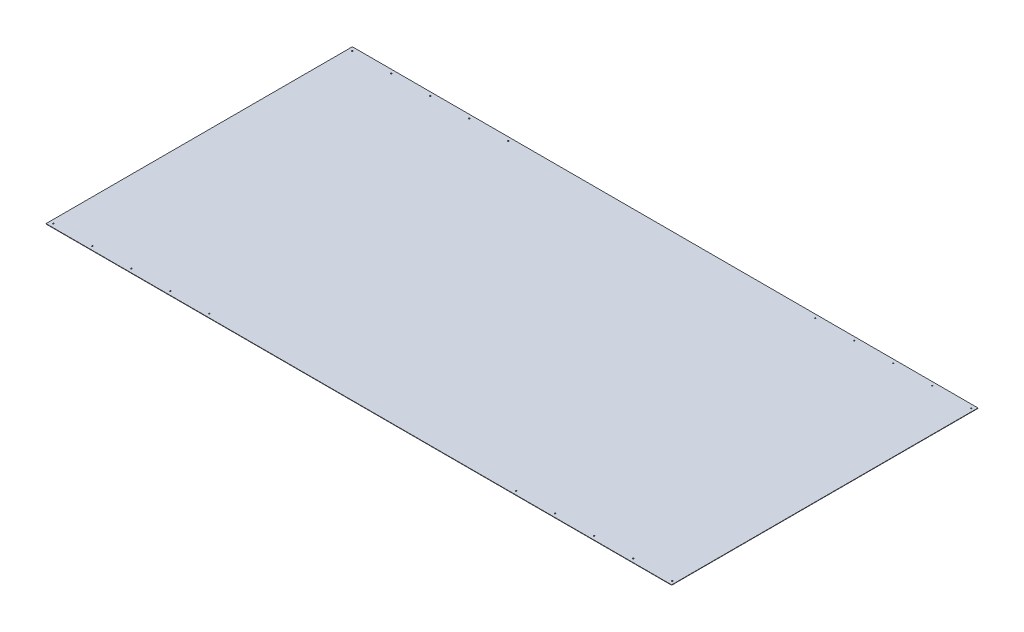
ISO-10303-21;
HEADER;
FILE_DESCRIPTION(('STEP AP214'),'2;1');
FILE_NAME('part.step','',(''),(''),'','','');
FILE_SCHEMA(('AUTOMOTIVE_DESIGN { 1 0 10303 214 1 1 1 1 }'));
ENDSEC;
DATA;
#1=APPLICATION_CONTEXT('core data for automotive mechanical design processes');
#2=APPLICATION_PROTOCOL_DEFINITION('international standard','automotive_design',2000,#1);
#3=PRODUCT_CONTEXT('',#1,'mechanical');
#4=PRODUCT('Part','Part','',(#3));
#5=PRODUCT_RELATED_PRODUCT_CATEGORY('part','',(#4));
#6=PRODUCT_DEFINITION_FORMATION('','',#4);
#7=PRODUCT_DEFINITION_CONTEXT('part definition',#1,'design');
#8=PRODUCT_DEFINITION('design','',#6,#7);
#9=PRODUCT_DEFINITION_SHAPE('','',#8);
#10=(LENGTH_UNIT() NAMED_UNIT(*) SI_UNIT(.MILLI.,.METRE.));
#11=(NAMED_UNIT(*) PLANE_ANGLE_UNIT() SI_UNIT($,.RADIAN.));
#12=(NAMED_UNIT(*) SI_UNIT($,.STERADIAN.) SOLID_ANGLE_UNIT());
#13=UNCERTAINTY_MEASURE_WITH_UNIT(LENGTH_MEASURE(1.E-05),#10,'distance_accuracy_value','');
#14=(GEOMETRIC_REPRESENTATION_CONTEXT(3) GLOBAL_UNCERTAINTY_ASSIGNED_CONTEXT((#13)) GLOBAL_UNIT_ASSIGNED_CONTEXT((#10,
#11,#12)) REPRESENTATION_CONTEXT('',''));
#15=CARTESIAN_POINT('',(0.,0.,0.));
#16=DIRECTION('',(0.,0.,1.));
#17=DIRECTION('',(1.,0.,0.));
#18=AXIS2_PLACEMENT_3D('',#15,#16,#17);
#19=CARTESIAN_POINT('',(-1704.25,2.,834.5));
#20=DIRECTION('',(1.,0.,0.));
#21=DIRECTION('',(0.,0.,-1.));
#22=AXIS2_PLACEMENT_3D('',#19,#20,#21);
#23=PLANE('',#22);
#24=DIRECTION('',(0.,0.,1.));
#25=VECTOR('',#24,1.);
#26=CARTESIAN_POINT('',(-1704.25,0.,834.5));
#27=LINE('',#26,#25);
#28=CARTESIAN_POINT('',(-1704.25,0.,-834.5));
#29=VERTEX_POINT('',#28);
#30=CARTESIAN_POINT('',(-1704.25,0.,834.5));
#31=VERTEX_POINT('',#30);
#32=EDGE_CURVE('E99',#29,#31,#27,.T.);
#33=ORIENTED_EDGE('',*,*,#32,.T.);
#34=DIRECTION('',(0.,-1.,0.));
#35=VECTOR('',#34,1.);
#36=CARTESIAN_POINT('',(-1704.25,2.,834.5));
#37=LINE('',#36,#35);
#38=CARTESIAN_POINT('',(-1704.25,2.,834.5));
#39=VERTEX_POINT('',#38);
#40=EDGE_CURVE('E11',#39,#31,#37,.T.);
#41=ORIENTED_EDGE('',*,*,#40,.F.);
#42=DIRECTION('',(0.,0.,1.));
#43=VECTOR('',#42,1.);
#44=CARTESIAN_POINT('',(-1704.25,2.,834.5));
#45=LINE('',#44,#43);
#46=CARTESIAN_POINT('',(-1704.25,2.,-834.5));
#47=VERTEX_POINT('',#46);
#48=EDGE_CURVE('E86',#47,#39,#45,.T.);
#49=ORIENTED_EDGE('',*,*,#48,.F.);
#50=DIRECTION('',(0.,-1.,0.));
#51=VECTOR('',#50,1.);
#52=CARTESIAN_POINT('',(-1704.25,2.,-834.5));
#53=LINE('',#52,#51);
#54=EDGE_CURVE('E95',#47,#29,#53,.T.);
#55=ORIENTED_EDGE('',*,*,#54,.T.);
#56=EDGE_LOOP('',(#33,#41,#49,#55));
#57=FACE_BOUND('',#56,.T.);
#58=ADVANCED_FACE('F33',(#57),#23,.F.);
#59=CARTESIAN_POINT('',(1704.25,2.,834.5));
#60=DIRECTION('',(0.,0.,-1.));
#61=DIRECTION('',(-1.,0.,0.));
#62=AXIS2_PLACEMENT_3D('',#59,#60,#61);
#63=PLANE('',#62);
#64=DIRECTION('',(1.,0.,0.));
#65=VECTOR('',#64,1.);
#66=CARTESIAN_POINT('',(1704.25,0.,834.5));
#67=LINE('',#66,#65);
#68=CARTESIAN_POINT('',(1704.25,0.,834.5));
#69=VERTEX_POINT('',#68);
#70=EDGE_CURVE('E90',#31,#69,#67,.T.);
#71=ORIENTED_EDGE('',*,*,#70,.T.);
#72=DIRECTION('',(0.,-1.,0.));
#73=VECTOR('',#72,1.);
#74=CARTESIAN_POINT('',(1704.25,2.,834.5));
#75=LINE('',#74,#73);
#76=CARTESIAN_POINT('',(1704.25,2.,834.5));
#77=VERTEX_POINT('',#76);
#78=EDGE_CURVE('E42',#77,#69,#75,.T.);
#79=ORIENTED_EDGE('',*,*,#78,.F.);
#80=DIRECTION('',(1.,0.,0.));
#81=VECTOR('',#80,1.);
#82=CARTESIAN_POINT('',(1704.25,2.,834.5));
#83=LINE('',#82,#81);
#84=EDGE_CURVE('E81',#39,#77,#83,.T.);
#85=ORIENTED_EDGE('',*,*,#84,.F.);
#86=ORIENTED_EDGE('',*,*,#40,.T.);
#87=EDGE_LOOP('',(#71,#79,#85,#86));
#88=FACE_BOUND('',#87,.T.);
#89=ADVANCED_FACE('F89',(#88),#63,.F.);
#90=CARTESIAN_POINT('',(1704.25,2.,834.5));
#91=DIRECTION('',(-1.,0.,0.));
#92=DIRECTION('',(0.,0.,1.));
#93=AXIS2_PLACEMENT_3D('',#90,#91,#92);
#94=PLANE('',#93);
#95=DIRECTION('',(0.,0.,-1.));
#96=VECTOR('',#95,1.);
#97=CARTESIAN_POINT('',(1704.25,0.,834.5));
#98=LINE('',#97,#96);
#99=CARTESIAN_POINT('',(1704.25,0.,-834.5));
#100=VERTEX_POINT('',#99);
#101=EDGE_CURVE('E68',#69,#100,#98,.T.);
#102=ORIENTED_EDGE('',*,*,#101,.T.);
#103=DIRECTION('',(0.,-1.,0.));
#104=VECTOR('',#103,1.);
#105=CARTESIAN_POINT('',(1704.25,2.,-834.5));
#106=LINE('',#105,#104);
#107=CARTESIAN_POINT('',(1704.25,2.,-834.5));
#108=VERTEX_POINT('',#107);
#109=EDGE_CURVE('E91',#108,#100,#106,.T.);
#110=ORIENTED_EDGE('',*,*,#109,.F.);
#111=DIRECTION('',(0.,0.,-1.));
#112=VECTOR('',#111,1.);
#113=CARTESIAN_POINT('',(1704.25,2.,834.5));
#114=LINE('',#113,#112);
#115=EDGE_CURVE('E84',#77,#108,#114,.T.);
#116=ORIENTED_EDGE('',*,*,#115,.F.);
#117=ORIENTED_EDGE('',*,*,#78,.T.);
#118=EDGE_LOOP('',(#102,#110,#116,#117));
#119=FACE_BOUND('',#118,.T.);
#120=ADVANCED_FACE('F93',(#119),#94,.F.);
#121=CARTESIAN_POINT('',(1704.25,2.,-834.5));
#122=DIRECTION('',(0.,0.,1.));
#123=DIRECTION('',(1.,0.,0.));
#124=AXIS2_PLACEMENT_3D('',#121,#122,#123);
#125=PLANE('',#124);
#126=DIRECTION('',(-1.,0.,0.));
#127=VECTOR('',#126,1.);
#128=CARTESIAN_POINT('',(1704.25,0.,-834.5));
#129=LINE('',#128,#127);
#130=EDGE_CURVE('E74',#100,#29,#129,.T.);
#131=ORIENTED_EDGE('',*,*,#130,.T.);
#132=ORIENTED_EDGE('',*,*,#54,.F.);
#133=DIRECTION('',(-1.,0.,0.));
#134=VECTOR('',#133,1.);
#135=CARTESIAN_POINT('',(1704.25,2.,-834.5));
#136=LINE('',#135,#134);
#137=EDGE_CURVE('E51',#108,#47,#136,.T.);
#138=ORIENTED_EDGE('',*,*,#137,.F.);
#139=ORIENTED_EDGE('',*,*,#109,.T.);
#140=EDGE_LOOP('',(#131,#132,#138,#139));
#141=FACE_BOUND('',#140,.T.);
#142=ADVANCED_FACE('F200',(#141),#125,.F.);
#143=CARTESIAN_POINT('',(0.,2.,0.));
#144=DIRECTION('',(0.,1.,0.));
#145=DIRECTION('',(0.,0.,1.));
#146=AXIS2_PLACEMENT_3D('',#143,#144,#145);
#147=PLANE('',#146);
#148=CARTESIAN_POINT('',(1474.75,2.,-814.499999999999));
#149=DIRECTION('',(0.,1.,0.));
#150=DIRECTION('',(0.,0.,1.));
#151=AXIS2_PLACEMENT_3D('',#148,#149,#150);
#152=CIRCLE('',#151,3.24999999999927);
#153=CARTESIAN_POINT('',(1474.75,2.,-811.25));
#154=VERTEX_POINT('',#153);
#155=EDGE_CURVE('E475',#154,#154,#152,.T.);
#156=ORIENTED_EDGE('',*,*,#155,.F.);
#157=EDGE_LOOP('',(#156));
#158=FACE_BOUND('',#157,.T.);
#159=CARTESIAN_POINT('',(1687.25,2.,814.5));
#160=DIRECTION('',(0.,1.,0.));
#161=DIRECTION('',(0.,0.,1.));
#162=AXIS2_PLACEMENT_3D('',#159,#160,#161);
#163=CIRCLE('',#162,3.24999999999927);
#164=CARTESIAN_POINT('',(1687.25,2.,817.749999999999));
#165=VERTEX_POINT('',#164);
#166=EDGE_CURVE('E469',#165,#165,#163,.T.);
#167=ORIENTED_EDGE('',*,*,#166,.F.);
#168=EDGE_LOOP('',(#167));
#169=FACE_BOUND('',#168,.T.);
#170=CARTESIAN_POINT('',(1687.25,2.,-814.5));
#171=DIRECTION('',(0.,1.,0.));
#172=DIRECTION('',(0.,0.,1.));
#173=AXIS2_PLACEMENT_3D('',#170,#171,#172);
#174=CIRCLE('',#173,3.24999999999927);
#175=CARTESIAN_POINT('',(1687.25,2.,-811.250000000001));
#176=VERTEX_POINT('',#175);
#177=EDGE_CURVE('E413',#176,#176,#174,.T.);
#178=ORIENTED_EDGE('',*,*,#177,.F.);
#179=EDGE_LOOP('',(#178));
#180=FACE_BOUND('',#179,.T.);
#181=CARTESIAN_POINT('',(-834.25,2.,814.5));
#182=DIRECTION('',(0.,1.,0.));
#183=DIRECTION('',(0.,0.,1.));
#184=AXIS2_PLACEMENT_3D('',#181,#182,#183);
#185=CIRCLE('',#184,3.24999999999924);
#186=CARTESIAN_POINT('',(-834.25,2.,817.749999999999));
#187=VERTEX_POINT('',#186);
#188=EDGE_CURVE('E468',#187,#187,#185,.T.);
#189=ORIENTED_EDGE('',*,*,#188,.F.);
#190=EDGE_LOOP('',(#189));
#191=FACE_BOUND('',#190,.T.);
#192=CARTESIAN_POINT('',(1049.75,2.,-814.499999999996));
#193=DIRECTION('',(0.,1.,0.));
#194=DIRECTION('',(0.,0.,1.));
#195=AXIS2_PLACEMENT_3D('',#192,#193,#194);
#196=CIRCLE('',#195,3.24999999999927);
#197=CARTESIAN_POINT('',(1049.75,2.,-811.249999999997));
#198=VERTEX_POINT('',#197);
#199=EDGE_CURVE('E529',#198,#198,#196,.T.);
#200=ORIENTED_EDGE('',*,*,#199,.F.);
#201=EDGE_LOOP('',(#200));
#202=FACE_BOUND('',#201,.T.);
#203=CARTESIAN_POINT('',(1262.25,2.,814.500000000003));
#204=DIRECTION('',(0.,1.,0.));
#205=DIRECTION('',(0.,0.,1.));
#206=AXIS2_PLACEMENT_3D('',#203,#204,#205);
#207=CIRCLE('',#206,3.24999999999927);
#208=CARTESIAN_POINT('',(1262.25,2.,817.750000000002));
#209=VERTEX_POINT('',#208);
#210=EDGE_CURVE('E532',#209,#209,#207,.T.);
#211=ORIENTED_EDGE('',*,*,#210,.F.);
#212=EDGE_LOOP('',(#211));
#213=FACE_BOUND('',#212,.T.);
#214=CARTESIAN_POINT('',(1262.25,2.,-814.499999999997));
#215=DIRECTION('',(0.,1.,0.));
#216=DIRECTION('',(0.,0.,1.));
#217=AXIS2_PLACEMENT_3D('',#214,#215,#216);
#218=CIRCLE('',#217,3.24999999999927);
#219=CARTESIAN_POINT('',(1262.25,2.,-811.249999999998));
#220=VERTEX_POINT('',#219);
#221=EDGE_CURVE('E538',#220,#220,#218,.T.);
#222=ORIENTED_EDGE('',*,*,#221,.F.);
#223=EDGE_LOOP('',(#222));
#224=FACE_BOUND('',#223,.T.);
#225=CARTESIAN_POINT('',(1474.75,2.,814.500000000001));
#226=DIRECTION('',(0.,1.,0.));
#227=DIRECTION('',(0.,0.,1.));
#228=AXIS2_PLACEMENT_3D('',#225,#226,#227);
#229=CIRCLE('',#228,3.24999999999927);
#230=CARTESIAN_POINT('',(1474.75,2.,817.750000000001));
#231=VERTEX_POINT('',#230);
#232=EDGE_CURVE('E540',#231,#231,#229,.T.);
#233=ORIENTED_EDGE('',*,*,#232,.F.);
#234=EDGE_LOOP('',(#233));
#235=FACE_BOUND('',#234,.T.);
#236=CARTESIAN_POINT('',(-1259.25,2.,-814.5));
#237=DIRECTION('',(0.,1.,0.));
#238=DIRECTION('',(0.,0.,1.));
#239=AXIS2_PLACEMENT_3D('',#236,#237,#238);
#240=CIRCLE('',#239,3.24999999999927);
#241=CARTESIAN_POINT('',(-1259.25,2.,-811.250000000001));
#242=VERTEX_POINT('',#241);
#243=EDGE_CURVE('E488',#242,#242,#240,.T.);
#244=ORIENTED_EDGE('',*,*,#243,.F.);
#245=EDGE_LOOP('',(#244));
#246=FACE_BOUND('',#245,.T.);
#247=CARTESIAN_POINT('',(-1471.75,2.,814.5));
#248=DIRECTION('',(0.,1.,0.));
#249=DIRECTION('',(0.,0.,1.));
#250=AXIS2_PLACEMENT_3D('',#247,#248,#249);
#251=CIRCLE('',#250,3.24999999999927);
#252=CARTESIAN_POINT('',(-1471.75,2.,817.749999999999));
#253=VERTEX_POINT('',#252);
#254=EDGE_CURVE('E491',#253,#253,#251,.T.);
#255=ORIENTED_EDGE('',*,*,#254,.F.);
#256=EDGE_LOOP('',(#255));
#257=FACE_BOUND('',#256,.T.);
#258=CARTESIAN_POINT('',(-1471.75,2.,-814.5));
#259=DIRECTION('',(0.,1.,0.));
#260=DIRECTION('',(0.,0.,1.));
#261=AXIS2_PLACEMENT_3D('',#258,#259,#260);
#262=CIRCLE('',#261,3.24999999999927);
#263=CARTESIAN_POINT('',(-1471.75,2.,-811.250000000001));
#264=VERTEX_POINT('',#263);
#265=EDGE_CURVE('E494',#264,#264,#262,.T.);
#266=ORIENTED_EDGE('',*,*,#265,.F.);
#267=EDGE_LOOP('',(#266));
#268=FACE_BOUND('',#267,.T.);
#269=CARTESIAN_POINT('',(-1684.25,2.,814.5));
#270=DIRECTION('',(0.,1.,0.));
#271=DIRECTION('',(0.,0.,1.));
#272=AXIS2_PLACEMENT_3D('',#269,#270,#271);
#273=CIRCLE('',#272,3.24999999999927);
#274=CARTESIAN_POINT('',(-1684.25,2.,817.749999999999));
#275=VERTEX_POINT('',#274);
#276=EDGE_CURVE('E497',#275,#275,#273,.T.);
#277=ORIENTED_EDGE('',*,*,#276,.F.);
#278=EDGE_LOOP('',(#277));
#279=FACE_BOUND('',#278,.T.);
#280=CARTESIAN_POINT('',(-834.25,2.,-814.5));
#281=DIRECTION('',(0.,1.,0.));
#282=DIRECTION('',(0.,0.,1.));
#283=AXIS2_PLACEMENT_3D('',#280,#281,#282);
#284=CIRCLE('',#283,3.24999999999924);
#285=CARTESIAN_POINT('',(-834.25,2.,-811.250000000001));
#286=VERTEX_POINT('',#285);
#287=EDGE_CURVE('E472',#286,#286,#284,.T.);
#288=ORIENTED_EDGE('',*,*,#287,.F.);
#289=EDGE_LOOP('',(#288));
#290=FACE_BOUND('',#289,.T.);
#291=CARTESIAN_POINT('',(-1046.75,2.,814.5));
#292=DIRECTION('',(0.,1.,0.));
#293=DIRECTION('',(0.,0.,1.));
#294=AXIS2_PLACEMENT_3D('',#291,#292,#293);
#295=CIRCLE('',#294,3.24999999999927);
#296=CARTESIAN_POINT('',(-1046.75,2.,817.749999999999));
#297=VERTEX_POINT('',#296);
#298=EDGE_CURVE('E479',#297,#297,#295,.T.);
#299=ORIENTED_EDGE('',*,*,#298,.F.);
#300=EDGE_LOOP('',(#299));
#301=FACE_BOUND('',#300,.T.);
#302=CARTESIAN_POINT('',(-1046.75,2.,-814.5));
#303=DIRECTION('',(0.,1.,0.));
#304=DIRECTION('',(0.,0.,1.));
#305=AXIS2_PLACEMENT_3D('',#302,#303,#304);
#306=CIRCLE('',#305,3.24999999999927);
#307=CARTESIAN_POINT('',(-1046.75,2.,-811.250000000001));
#308=VERTEX_POINT('',#307);
#309=EDGE_CURVE('E482',#308,#308,#306,.T.);
#310=ORIENTED_EDGE('',*,*,#309,.F.);
#311=EDGE_LOOP('',(#310));
#312=FACE_BOUND('',#311,.T.);
#313=CARTESIAN_POINT('',(-1259.25,2.,814.5));
#314=DIRECTION('',(0.,1.,0.));
#315=DIRECTION('',(0.,0.,1.));
#316=AXIS2_PLACEMENT_3D('',#313,#314,#315);
#317=CIRCLE('',#316,3.24999999999927);
#318=CARTESIAN_POINT('',(-1259.25,2.,817.749999999999));
#319=VERTEX_POINT('',#318);
#320=EDGE_CURVE('E485',#319,#319,#317,.T.);
#321=ORIENTED_EDGE('',*,*,#320,.F.);
#322=EDGE_LOOP('',(#321));
#323=FACE_BOUND('',#322,.T.);
#324=CARTESIAN_POINT('',(837.25,2.,814.500000000006));
#325=DIRECTION('',(0.,1.,0.));
#326=DIRECTION('',(0.,0.,1.));
#327=AXIS2_PLACEMENT_3D('',#324,#325,#326);
#328=CIRCLE('',#327,3.24999999999924);
#329=CARTESIAN_POINT('',(837.25,2.,817.750000000005));
#330=VERTEX_POINT('',#329);
#331=EDGE_CURVE('E521',#330,#330,#328,.T.);
#332=ORIENTED_EDGE('',*,*,#331,.F.);
#333=EDGE_LOOP('',(#332));
#334=FACE_BOUND('',#333,.T.);
#335=CARTESIAN_POINT('',(837.25,2.,-814.499999999995));
#336=DIRECTION('',(0.,1.,0.));
#337=DIRECTION('',(0.,0.,1.));
#338=AXIS2_PLACEMENT_3D('',#335,#336,#337);
#339=CIRCLE('',#338,3.24999999999924);
#340=CARTESIAN_POINT('',(837.25,2.,-811.249999999995));
#341=VERTEX_POINT('',#340);
#342=EDGE_CURVE('E525',#341,#341,#339,.T.);
#343=ORIENTED_EDGE('',*,*,#342,.F.);
#344=EDGE_LOOP('',(#343));
#345=FACE_BOUND('',#344,.T.);
#346=CARTESIAN_POINT('',(1049.75,2.,814.500000000004));
#347=DIRECTION('',(0.,1.,0.));
#348=DIRECTION('',(0.,0.,1.));
#349=AXIS2_PLACEMENT_3D('',#346,#347,#348);
#350=CIRCLE('',#349,3.24999999999927);
#351=CARTESIAN_POINT('',(1049.75,2.,817.750000000004));
#352=VERTEX_POINT('',#351);
#353=EDGE_CURVE('E528',#352,#352,#350,.T.);
#354=ORIENTED_EDGE('',*,*,#353,.F.);
#355=EDGE_LOOP('',(#354));
#356=FACE_BOUND('',#355,.T.);
#357=CARTESIAN_POINT('',(-1684.25,2.,-814.5));
#358=DIRECTION('',(0.,1.,0.));
#359=DIRECTION('',(0.,0.,1.));
#360=AXIS2_PLACEMENT_3D('',#357,#358,#359);
#361=CIRCLE('',#360,3.24999999999927);
#362=CARTESIAN_POINT('',(-1684.25,2.,-811.250000000001));
#363=VERTEX_POINT('',#362);
#364=EDGE_CURVE('E111',#363,#363,#361,.T.);
#365=ORIENTED_EDGE('',*,*,#364,.F.);
#366=EDGE_LOOP('',(#365));
#367=FACE_BOUND('',#366,.T.);
#368=ORIENTED_EDGE('',*,*,#48,.T.);
#369=ORIENTED_EDGE('',*,*,#84,.T.);
#370=ORIENTED_EDGE('',*,*,#115,.T.);
#371=ORIENTED_EDGE('',*,*,#137,.T.);
#372=EDGE_LOOP('',(#368,#369,#370,#371));
#373=FACE_BOUND('',#372,.T.);
#374=ADVANCED_FACE('F82',(#158,#169,#180,#191,#202,#213,#224,#235,#246,#257,#268,#279,#290,#301,
#312,#323,#334,#345,#356,#367,#373),#147,.T.);
#375=CARTESIAN_POINT('',(0.,0.,0.));
#376=DIRECTION('',(0.,1.,0.));
#377=DIRECTION('',(0.,0.,1.));
#378=AXIS2_PLACEMENT_3D('',#375,#376,#377);
#379=PLANE('',#378);
#380=CARTESIAN_POINT('',(1474.75,0.,-814.499999999999));
#381=DIRECTION('',(0.,1.,0.));
#382=DIRECTION('',(0.,0.,1.));
#383=AXIS2_PLACEMENT_3D('',#380,#381,#382);
#384=CIRCLE('',#383,3.24999999999927);
#385=CARTESIAN_POINT('',(1474.75,0.,-811.25));
#386=VERTEX_POINT('',#385);
#387=EDGE_CURVE('E36',#386,#386,#384,.T.);
#388=ORIENTED_EDGE('',*,*,#387,.T.);
#389=EDGE_LOOP('',(#388));
#390=FACE_BOUND('',#389,.T.);
#391=CARTESIAN_POINT('',(1687.25,0.,814.5));
#392=DIRECTION('',(0.,1.,0.));
#393=DIRECTION('',(0.,0.,1.));
#394=AXIS2_PLACEMENT_3D('',#391,#392,#393);
#395=CIRCLE('',#394,3.24999999999927);
#396=CARTESIAN_POINT('',(1687.25,0.,817.749999999999));
#397=VERTEX_POINT('',#396);
#398=EDGE_CURVE('E161',#397,#397,#395,.T.);
#399=ORIENTED_EDGE('',*,*,#398,.T.);
#400=EDGE_LOOP('',(#399));
#401=FACE_BOUND('',#400,.T.);
#402=CARTESIAN_POINT('',(1687.25,0.,-814.5));
#403=DIRECTION('',(0.,1.,0.));
#404=DIRECTION('',(0.,0.,1.));
#405=AXIS2_PLACEMENT_3D('',#402,#403,#404);
#406=CIRCLE('',#405,3.24999999999927);
#407=CARTESIAN_POINT('',(1687.25,0.,-811.250000000001));
#408=VERTEX_POINT('',#407);
#409=EDGE_CURVE('E159',#408,#408,#406,.T.);
#410=ORIENTED_EDGE('',*,*,#409,.T.);
#411=EDGE_LOOP('',(#410));
#412=FACE_BOUND('',#411,.T.);
#413=CARTESIAN_POINT('',(-834.25,0.,814.5));
#414=DIRECTION('',(0.,1.,0.));
#415=DIRECTION('',(0.,0.,1.));
#416=AXIS2_PLACEMENT_3D('',#413,#414,#415);
#417=CIRCLE('',#416,3.24999999999924);
#418=CARTESIAN_POINT('',(-834.25,0.,817.749999999999));
#419=VERTEX_POINT('',#418);
#420=EDGE_CURVE('E156',#419,#419,#417,.T.);
#421=ORIENTED_EDGE('',*,*,#420,.T.);
#422=EDGE_LOOP('',(#421));
#423=FACE_BOUND('',#422,.T.);
#424=CARTESIAN_POINT('',(1049.75,0.,-814.499999999996));
#425=DIRECTION('',(0.,1.,0.));
#426=DIRECTION('',(0.,0.,1.));
#427=AXIS2_PLACEMENT_3D('',#424,#425,#426);
#428=CIRCLE('',#427,3.24999999999927);
#429=CARTESIAN_POINT('',(1049.75,0.,-811.249999999997));
#430=VERTEX_POINT('',#429);
#431=EDGE_CURVE('E153',#430,#430,#428,.T.);
#432=ORIENTED_EDGE('',*,*,#431,.T.);
#433=EDGE_LOOP('',(#432));
#434=FACE_BOUND('',#433,.T.);
#435=CARTESIAN_POINT('',(1262.25,0.,814.500000000003));
#436=DIRECTION('',(0.,1.,0.));
#437=DIRECTION('',(0.,0.,1.));
#438=AXIS2_PLACEMENT_3D('',#435,#436,#437);
#439=CIRCLE('',#438,3.24999999999927);
#440=CARTESIAN_POINT('',(1262.25,0.,817.750000000002));
#441=VERTEX_POINT('',#440);
#442=EDGE_CURVE('E150',#441,#441,#439,.T.);
#443=ORIENTED_EDGE('',*,*,#442,.T.);
#444=EDGE_LOOP('',(#443));
#445=FACE_BOUND('',#444,.T.);
#446=CARTESIAN_POINT('',(1262.25,0.,-814.499999999997));
#447=DIRECTION('',(0.,1.,0.));
#448=DIRECTION('',(0.,0.,1.));
#449=AXIS2_PLACEMENT_3D('',#446,#447,#448);
#450=CIRCLE('',#449,3.24999999999927);
#451=CARTESIAN_POINT('',(1262.25,0.,-811.249999999998));
#452=VERTEX_POINT('',#451);
#453=EDGE_CURVE('E147',#452,#452,#450,.T.);
#454=ORIENTED_EDGE('',*,*,#453,.T.);
#455=EDGE_LOOP('',(#454));
#456=FACE_BOUND('',#455,.T.);
#457=CARTESIAN_POINT('',(1474.75,0.,814.500000000001));
#458=DIRECTION('',(0.,1.,0.));
#459=DIRECTION('',(0.,0.,1.));
#460=AXIS2_PLACEMENT_3D('',#457,#458,#459);
#461=CIRCLE('',#460,3.24999999999927);
#462=CARTESIAN_POINT('',(1474.75,0.,817.750000000001));
#463=VERTEX_POINT('',#462);
#464=EDGE_CURVE('E144',#463,#463,#461,.T.);
#465=ORIENTED_EDGE('',*,*,#464,.T.);
#466=EDGE_LOOP('',(#465));
#467=FACE_BOUND('',#466,.T.);
#468=CARTESIAN_POINT('',(-1259.25,0.,-814.5));
#469=DIRECTION('',(0.,1.,0.));
#470=DIRECTION('',(0.,0.,1.));
#471=AXIS2_PLACEMENT_3D('',#468,#469,#470);
#472=CIRCLE('',#471,3.24999999999927);
#473=CARTESIAN_POINT('',(-1259.25,0.,-811.250000000001));
#474=VERTEX_POINT('',#473);
#475=EDGE_CURVE('E141',#474,#474,#472,.T.);
#476=ORIENTED_EDGE('',*,*,#475,.T.);
#477=EDGE_LOOP('',(#476));
#478=FACE_BOUND('',#477,.T.);
#479=CARTESIAN_POINT('',(-1471.75,0.,814.5));
#480=DIRECTION('',(0.,1.,0.));
#481=DIRECTION('',(0.,0.,1.));
#482=AXIS2_PLACEMENT_3D('',#479,#480,#481);
#483=CIRCLE('',#482,3.24999999999927);
#484=CARTESIAN_POINT('',(-1471.75,0.,817.749999999999));
#485=VERTEX_POINT('',#484);
#486=EDGE_CURVE('E138',#485,#485,#483,.T.);
#487=ORIENTED_EDGE('',*,*,#486,.T.);
#488=EDGE_LOOP('',(#487));
#489=FACE_BOUND('',#488,.T.);
#490=CARTESIAN_POINT('',(-1471.75,0.,-814.5));
#491=DIRECTION('',(0.,1.,0.));
#492=DIRECTION('',(0.,0.,1.));
#493=AXIS2_PLACEMENT_3D('',#490,#491,#492);
#494=CIRCLE('',#493,3.24999999999927);
#495=CARTESIAN_POINT('',(-1471.75,0.,-811.250000000001));
#496=VERTEX_POINT('',#495);
#497=EDGE_CURVE('E135',#496,#496,#494,.T.);
#498=ORIENTED_EDGE('',*,*,#497,.T.);
#499=EDGE_LOOP('',(#498));
#500=FACE_BOUND('',#499,.T.);
#501=CARTESIAN_POINT('',(-1684.25,0.,814.5));
#502=DIRECTION('',(0.,1.,0.));
#503=DIRECTION('',(0.,0.,1.));
#504=AXIS2_PLACEMENT_3D('',#501,#502,#503);
#505=CIRCLE('',#504,3.24999999999927);
#506=CARTESIAN_POINT('',(-1684.25,0.,817.749999999999));
#507=VERTEX_POINT('',#506);
#508=EDGE_CURVE('E132',#507,#507,#505,.T.);
#509=ORIENTED_EDGE('',*,*,#508,.T.);
#510=EDGE_LOOP('',(#509));
#511=FACE_BOUND('',#510,.T.);
#512=CARTESIAN_POINT('',(-834.25,0.,-814.5));
#513=DIRECTION('',(0.,1.,0.));
#514=DIRECTION('',(0.,0.,1.));
#515=AXIS2_PLACEMENT_3D('',#512,#513,#514);
#516=CIRCLE('',#515,3.24999999999924);
#517=CARTESIAN_POINT('',(-834.25,0.,-811.250000000001));
#518=VERTEX_POINT('',#517);
#519=EDGE_CURVE('E129',#518,#518,#516,.T.);
#520=ORIENTED_EDGE('',*,*,#519,.T.);
#521=EDGE_LOOP('',(#520));
#522=FACE_BOUND('',#521,.T.);
#523=CARTESIAN_POINT('',(-1046.75,0.,814.5));
#524=DIRECTION('',(0.,1.,0.));
#525=DIRECTION('',(0.,0.,1.));
#526=AXIS2_PLACEMENT_3D('',#523,#524,#525);
#527=CIRCLE('',#526,3.24999999999927);
#528=CARTESIAN_POINT('',(-1046.75,0.,817.749999999999));
#529=VERTEX_POINT('',#528);
#530=EDGE_CURVE('E126',#529,#529,#527,.T.);
#531=ORIENTED_EDGE('',*,*,#530,.T.);
#532=EDGE_LOOP('',(#531));
#533=FACE_BOUND('',#532,.T.);
#534=CARTESIAN_POINT('',(-1046.75,0.,-814.5));
#535=DIRECTION('',(0.,1.,0.));
#536=DIRECTION('',(0.,0.,1.));
#537=AXIS2_PLACEMENT_3D('',#534,#535,#536);
#538=CIRCLE('',#537,3.24999999999927);
#539=CARTESIAN_POINT('',(-1046.75,0.,-811.250000000001));
#540=VERTEX_POINT('',#539);
#541=EDGE_CURVE('E123',#540,#540,#538,.T.);
#542=ORIENTED_EDGE('',*,*,#541,.T.);
#543=EDGE_LOOP('',(#542));
#544=FACE_BOUND('',#543,.T.);
#545=CARTESIAN_POINT('',(-1259.25,0.,814.5));
#546=DIRECTION('',(0.,1.,0.));
#547=DIRECTION('',(0.,0.,1.));
#548=AXIS2_PLACEMENT_3D('',#545,#546,#547);
#549=CIRCLE('',#548,3.24999999999927);
#550=CARTESIAN_POINT('',(-1259.25,0.,817.749999999999));
#551=VERTEX_POINT('',#550);
#552=EDGE_CURVE('E120',#551,#551,#549,.T.);
#553=ORIENTED_EDGE('',*,*,#552,.T.);
#554=EDGE_LOOP('',(#553));
#555=FACE_BOUND('',#554,.T.);
#556=CARTESIAN_POINT('',(837.25,0.,814.500000000006));
#557=DIRECTION('',(0.,1.,0.));
#558=DIRECTION('',(0.,0.,1.));
#559=AXIS2_PLACEMENT_3D('',#556,#557,#558);
#560=CIRCLE('',#559,3.24999999999924);
#561=CARTESIAN_POINT('',(837.25,0.,817.750000000005));
#562=VERTEX_POINT('',#561);
#563=EDGE_CURVE('E117',#562,#562,#560,.T.);
#564=ORIENTED_EDGE('',*,*,#563,.T.);
#565=EDGE_LOOP('',(#564));
#566=FACE_BOUND('',#565,.T.);
#567=CARTESIAN_POINT('',(837.25,0.,-814.499999999995));
#568=DIRECTION('',(0.,1.,0.));
#569=DIRECTION('',(0.,0.,1.));
#570=AXIS2_PLACEMENT_3D('',#567,#568,#569);
#571=CIRCLE('',#570,3.24999999999924);
#572=CARTESIAN_POINT('',(837.25,0.,-811.249999999995));
#573=VERTEX_POINT('',#572);
#574=EDGE_CURVE('E114',#573,#573,#571,.T.);
#575=ORIENTED_EDGE('',*,*,#574,.T.);
#576=EDGE_LOOP('',(#575));
#577=FACE_BOUND('',#576,.T.);
#578=CARTESIAN_POINT('',(1049.75,0.,814.500000000004));
#579=DIRECTION('',(0.,1.,0.));
#580=DIRECTION('',(0.,0.,1.));
#581=AXIS2_PLACEMENT_3D('',#578,#579,#580);
#582=CIRCLE('',#581,3.24999999999927);
#583=CARTESIAN_POINT('',(1049.75,0.,817.750000000004));
#584=VERTEX_POINT('',#583);
#585=EDGE_CURVE('E110',#584,#584,#582,.T.);
#586=ORIENTED_EDGE('',*,*,#585,.T.);
#587=EDGE_LOOP('',(#586));
#588=FACE_BOUND('',#587,.T.);
#589=CARTESIAN_POINT('',(-1684.25,0.,-814.5));
#590=DIRECTION('',(0.,1.,0.));
#591=DIRECTION('',(0.,0.,1.));
#592=AXIS2_PLACEMENT_3D('',#589,#590,#591);
#593=CIRCLE('',#592,3.24999999999927);
#594=CARTESIAN_POINT('',(-1684.25,0.,-811.250000000001));
#595=VERTEX_POINT('',#594);
#596=EDGE_CURVE('E107',#595,#595,#593,.T.);
#597=ORIENTED_EDGE('',*,*,#596,.T.);
#598=EDGE_LOOP('',(#597));
#599=FACE_BOUND('',#598,.T.);
#600=ORIENTED_EDGE('',*,*,#32,.F.);
#601=ORIENTED_EDGE('',*,*,#130,.F.);
#602=ORIENTED_EDGE('',*,*,#101,.F.);
#603=ORIENTED_EDGE('',*,*,#70,.F.);
#604=EDGE_LOOP('',(#600,#601,#602,#603));
#605=FACE_BOUND('',#604,.T.);
#606=ADVANCED_FACE('F168',(#390,#401,#412,#423,#434,#445,#456,#467,#478,#489,#500,#511,#522,
#533,#544,#555,#566,#577,#588,#599,#605),#379,.F.);
#607=CARTESIAN_POINT('',(-1684.25,-8.,-814.5));
#608=DIRECTION('',(0.,1.,0.));
#609=DIRECTION('',(0.,0.,1.));
#610=AXIS2_PLACEMENT_3D('',#607,#608,#609);
#611=CYLINDRICAL_SURFACE('',#610,3.24999999999927);
#612=ORIENTED_EDGE('',*,*,#364,.T.);
#613=EDGE_LOOP('',(#612));
#614=FACE_BOUND('',#613,.T.);
#615=ORIENTED_EDGE('',*,*,#596,.F.);
#616=EDGE_LOOP('',(#615));
#617=FACE_BOUND('',#616,.T.);
#618=ADVANCED_FACE('F191',(#614,#617),#611,.F.);
#619=CARTESIAN_POINT('',(1049.75,-8.,814.500000000004));
#620=DIRECTION('',(0.,1.,0.));
#621=DIRECTION('',(0.,0.,1.));
#622=AXIS2_PLACEMENT_3D('',#619,#620,#621);
#623=CYLINDRICAL_SURFACE('',#622,3.24999999999927);
#624=ORIENTED_EDGE('',*,*,#353,.T.);
#625=EDGE_LOOP('',(#624));
#626=FACE_BOUND('',#625,.T.);
#627=ORIENTED_EDGE('',*,*,#585,.F.);
#628=EDGE_LOOP('',(#627));
#629=FACE_BOUND('',#628,.T.);
#630=ADVANCED_FACE('F197',(#626,#629),#623,.F.);
#631=CARTESIAN_POINT('',(837.25,-8.,-814.499999999995));
#632=DIRECTION('',(0.,1.,0.));
#633=DIRECTION('',(0.,0.,1.));
#634=AXIS2_PLACEMENT_3D('',#631,#632,#633);
#635=CYLINDRICAL_SURFACE('',#634,3.24999999999924);
#636=ORIENTED_EDGE('',*,*,#342,.T.);
#637=EDGE_LOOP('',(#636));
#638=FACE_BOUND('',#637,.T.);
#639=ORIENTED_EDGE('',*,*,#574,.F.);
#640=EDGE_LOOP('',(#639));
#641=FACE_BOUND('',#640,.T.);
#642=ADVANCED_FACE('F238',(#638,#641),#635,.F.);
#643=CARTESIAN_POINT('',(837.25,-8.,814.500000000006));
#644=DIRECTION('',(0.,1.,0.));
#645=DIRECTION('',(0.,0.,1.));
#646=AXIS2_PLACEMENT_3D('',#643,#644,#645);
#647=CYLINDRICAL_SURFACE('',#646,3.24999999999924);
#648=ORIENTED_EDGE('',*,*,#331,.T.);
#649=EDGE_LOOP('',(#648));
#650=FACE_BOUND('',#649,.T.);
#651=ORIENTED_EDGE('',*,*,#563,.F.);
#652=EDGE_LOOP('',(#651));
#653=FACE_BOUND('',#652,.T.);
#654=ADVANCED_FACE('F248',(#650,#653),#647,.F.);
#655=CARTESIAN_POINT('',(-1259.25,-8.,814.5));
#656=DIRECTION('',(0.,1.,0.));
#657=DIRECTION('',(0.,0.,1.));
#658=AXIS2_PLACEMENT_3D('',#655,#656,#657);
#659=CYLINDRICAL_SURFACE('',#658,3.24999999999927);
#660=ORIENTED_EDGE('',*,*,#320,.T.);
#661=EDGE_LOOP('',(#660));
#662=FACE_BOUND('',#661,.T.);
#663=ORIENTED_EDGE('',*,*,#552,.F.);
#664=EDGE_LOOP('',(#663));
#665=FACE_BOUND('',#664,.T.);
#666=ADVANCED_FACE('F258',(#662,#665),#659,.F.);
#667=CARTESIAN_POINT('',(-1046.75,-8.,-814.5));
#668=DIRECTION('',(0.,1.,0.));
#669=DIRECTION('',(0.,0.,1.));
#670=AXIS2_PLACEMENT_3D('',#667,#668,#669);
#671=CYLINDRICAL_SURFACE('',#670,3.24999999999927);
#672=ORIENTED_EDGE('',*,*,#309,.T.);
#673=EDGE_LOOP('',(#672));
#674=FACE_BOUND('',#673,.T.);
#675=ORIENTED_EDGE('',*,*,#541,.F.);
#676=EDGE_LOOP('',(#675));
#677=FACE_BOUND('',#676,.T.);
#678=ADVANCED_FACE('F268',(#674,#677),#671,.F.);
#679=CARTESIAN_POINT('',(-1046.75,-8.,814.5));
#680=DIRECTION('',(0.,1.,0.));
#681=DIRECTION('',(0.,0.,1.));
#682=AXIS2_PLACEMENT_3D('',#679,#680,#681);
#683=CYLINDRICAL_SURFACE('',#682,3.24999999999927);
#684=ORIENTED_EDGE('',*,*,#298,.T.);
#685=EDGE_LOOP('',(#684));
#686=FACE_BOUND('',#685,.T.);
#687=ORIENTED_EDGE('',*,*,#530,.F.);
#688=EDGE_LOOP('',(#687));
#689=FACE_BOUND('',#688,.T.);
#690=ADVANCED_FACE('F278',(#686,#689),#683,.F.);
#691=CARTESIAN_POINT('',(-834.25,-8.,-814.5));
#692=DIRECTION('',(0.,1.,0.));
#693=DIRECTION('',(0.,0.,1.));
#694=AXIS2_PLACEMENT_3D('',#691,#692,#693);
#695=CYLINDRICAL_SURFACE('',#694,3.24999999999924);
#696=ORIENTED_EDGE('',*,*,#287,.T.);
#697=EDGE_LOOP('',(#696));
#698=FACE_BOUND('',#697,.T.);
#699=ORIENTED_EDGE('',*,*,#519,.F.);
#700=EDGE_LOOP('',(#699));
#701=FACE_BOUND('',#700,.T.);
#702=ADVANCED_FACE('F288',(#698,#701),#695,.F.);
#703=CARTESIAN_POINT('',(-1684.25,-8.,814.5));
#704=DIRECTION('',(0.,1.,0.));
#705=DIRECTION('',(0.,0.,1.));
#706=AXIS2_PLACEMENT_3D('',#703,#704,#705);
#707=CYLINDRICAL_SURFACE('',#706,3.24999999999927);
#708=ORIENTED_EDGE('',*,*,#276,.T.);
#709=EDGE_LOOP('',(#708));
#710=FACE_BOUND('',#709,.T.);
#711=ORIENTED_EDGE('',*,*,#508,.F.);
#712=EDGE_LOOP('',(#711));
#713=FACE_BOUND('',#712,.T.);
#714=ADVANCED_FACE('F298',(#710,#713),#707,.F.);
#715=CARTESIAN_POINT('',(-1471.75,-8.,-814.5));
#716=DIRECTION('',(0.,1.,0.));
#717=DIRECTION('',(0.,0.,1.));
#718=AXIS2_PLACEMENT_3D('',#715,#716,#717);
#719=CYLINDRICAL_SURFACE('',#718,3.24999999999927);
#720=ORIENTED_EDGE('',*,*,#265,.T.);
#721=EDGE_LOOP('',(#720));
#722=FACE_BOUND('',#721,.T.);
#723=ORIENTED_EDGE('',*,*,#497,.F.);
#724=EDGE_LOOP('',(#723));
#725=FACE_BOUND('',#724,.T.);
#726=ADVANCED_FACE('F308',(#722,#725),#719,.F.);
#727=CARTESIAN_POINT('',(-1471.75,-8.,814.5));
#728=DIRECTION('',(0.,1.,0.));
#729=DIRECTION('',(0.,0.,1.));
#730=AXIS2_PLACEMENT_3D('',#727,#728,#729);
#731=CYLINDRICAL_SURFACE('',#730,3.24999999999927);
#732=ORIENTED_EDGE('',*,*,#254,.T.);
#733=EDGE_LOOP('',(#732));
#734=FACE_BOUND('',#733,.T.);
#735=ORIENTED_EDGE('',*,*,#486,.F.);
#736=EDGE_LOOP('',(#735));
#737=FACE_BOUND('',#736,.T.);
#738=ADVANCED_FACE('F318',(#734,#737),#731,.F.);
#739=CARTESIAN_POINT('',(-1259.25,-8.,-814.5));
#740=DIRECTION('',(0.,1.,0.));
#741=DIRECTION('',(0.,0.,1.));
#742=AXIS2_PLACEMENT_3D('',#739,#740,#741);
#743=CYLINDRICAL_SURFACE('',#742,3.24999999999927);
#744=ORIENTED_EDGE('',*,*,#243,.T.);
#745=EDGE_LOOP('',(#744));
#746=FACE_BOUND('',#745,.T.);
#747=ORIENTED_EDGE('',*,*,#475,.F.);
#748=EDGE_LOOP('',(#747));
#749=FACE_BOUND('',#748,.T.);
#750=ADVANCED_FACE('F328',(#746,#749),#743,.F.);
#751=CARTESIAN_POINT('',(1474.75,-8.,814.500000000001));
#752=DIRECTION('',(0.,1.,0.));
#753=DIRECTION('',(0.,0.,1.));
#754=AXIS2_PLACEMENT_3D('',#751,#752,#753);
#755=CYLINDRICAL_SURFACE('',#754,3.24999999999927);
#756=ORIENTED_EDGE('',*,*,#232,.T.);
#757=EDGE_LOOP('',(#756));
#758=FACE_BOUND('',#757,.T.);
#759=ORIENTED_EDGE('',*,*,#464,.F.);
#760=EDGE_LOOP('',(#759));
#761=FACE_BOUND('',#760,.T.);
#762=ADVANCED_FACE('F338',(#758,#761),#755,.F.);
#763=CARTESIAN_POINT('',(1262.25,-8.,-814.499999999997));
#764=DIRECTION('',(0.,1.,0.));
#765=DIRECTION('',(0.,0.,1.));
#766=AXIS2_PLACEMENT_3D('',#763,#764,#765);
#767=CYLINDRICAL_SURFACE('',#766,3.24999999999927);
#768=ORIENTED_EDGE('',*,*,#221,.T.);
#769=EDGE_LOOP('',(#768));
#770=FACE_BOUND('',#769,.T.);
#771=ORIENTED_EDGE('',*,*,#453,.F.);
#772=EDGE_LOOP('',(#771));
#773=FACE_BOUND('',#772,.T.);
#774=ADVANCED_FACE('F348',(#770,#773),#767,.F.);
#775=CARTESIAN_POINT('',(1262.25,-8.,814.500000000003));
#776=DIRECTION('',(0.,1.,0.));
#777=DIRECTION('',(0.,0.,1.));
#778=AXIS2_PLACEMENT_3D('',#775,#776,#777);
#779=CYLINDRICAL_SURFACE('',#778,3.24999999999927);
#780=ORIENTED_EDGE('',*,*,#210,.T.);
#781=EDGE_LOOP('',(#780));
#782=FACE_BOUND('',#781,.T.);
#783=ORIENTED_EDGE('',*,*,#442,.F.);
#784=EDGE_LOOP('',(#783));
#785=FACE_BOUND('',#784,.T.);
#786=ADVANCED_FACE('F358',(#782,#785),#779,.F.);
#787=CARTESIAN_POINT('',(1049.75,-8.,-814.499999999996));
#788=DIRECTION('',(0.,1.,0.));
#789=DIRECTION('',(0.,0.,1.));
#790=AXIS2_PLACEMENT_3D('',#787,#788,#789);
#791=CYLINDRICAL_SURFACE('',#790,3.24999999999927);
#792=ORIENTED_EDGE('',*,*,#199,.T.);
#793=EDGE_LOOP('',(#792));
#794=FACE_BOUND('',#793,.T.);
#795=ORIENTED_EDGE('',*,*,#431,.F.);
#796=EDGE_LOOP('',(#795));
#797=FACE_BOUND('',#796,.T.);
#798=ADVANCED_FACE('F368',(#794,#797),#791,.F.);
#799=CARTESIAN_POINT('',(-834.25,-8.,814.5));
#800=DIRECTION('',(0.,1.,0.));
#801=DIRECTION('',(0.,0.,1.));
#802=AXIS2_PLACEMENT_3D('',#799,#800,#801);
#803=CYLINDRICAL_SURFACE('',#802,3.24999999999924);
#804=ORIENTED_EDGE('',*,*,#188,.T.);
#805=EDGE_LOOP('',(#804));
#806=FACE_BOUND('',#805,.T.);
#807=ORIENTED_EDGE('',*,*,#420,.F.);
#808=EDGE_LOOP('',(#807));
#809=FACE_BOUND('',#808,.T.);
#810=ADVANCED_FACE('F378',(#806,#809),#803,.F.);
#811=CARTESIAN_POINT('',(1687.25,-8.,-814.5));
#812=DIRECTION('',(0.,1.,0.));
#813=DIRECTION('',(0.,0.,1.));
#814=AXIS2_PLACEMENT_3D('',#811,#812,#813);
#815=CYLINDRICAL_SURFACE('',#814,3.24999999999927);
#816=ORIENTED_EDGE('',*,*,#177,.T.);
#817=EDGE_LOOP('',(#816));
#818=FACE_BOUND('',#817,.T.);
#819=ORIENTED_EDGE('',*,*,#409,.F.);
#820=EDGE_LOOP('',(#819));
#821=FACE_BOUND('',#820,.T.);
#822=ADVANCED_FACE('F178',(#818,#821),#815,.F.);
#823=CARTESIAN_POINT('',(1687.25,-8.,814.5));
#824=DIRECTION('',(0.,1.,0.));
#825=DIRECTION('',(0.,0.,1.));
#826=AXIS2_PLACEMENT_3D('',#823,#824,#825);
#827=CYLINDRICAL_SURFACE('',#826,3.24999999999927);
#828=ORIENTED_EDGE('',*,*,#166,.T.);
#829=EDGE_LOOP('',(#828));
#830=FACE_BOUND('',#829,.T.);
#831=ORIENTED_EDGE('',*,*,#398,.F.);
#832=EDGE_LOOP('',(#831));
#833=FACE_BOUND('',#832,.T.);
#834=ADVANCED_FACE('F172',(#830,#833),#827,.F.);
#835=CARTESIAN_POINT('',(1474.75,-8.,-814.499999999999));
#836=DIRECTION('',(0.,1.,0.));
#837=DIRECTION('',(0.,0.,1.));
#838=AXIS2_PLACEMENT_3D('',#835,#836,#837);
#839=CYLINDRICAL_SURFACE('',#838,3.24999999999927);
#840=ORIENTED_EDGE('',*,*,#155,.T.);
#841=EDGE_LOOP('',(#840));
#842=FACE_BOUND('',#841,.T.);
#843=ORIENTED_EDGE('',*,*,#387,.F.);
#844=EDGE_LOOP('',(#843));
#845=FACE_BOUND('',#844,.T.);
#846=ADVANCED_FACE('F170',(#842,#845),#839,.F.);
#847=CLOSED_SHELL('',(#58,#89,#120,#142,#374,#606,#618,#630,#642,#654,#666,#678,#690,#702,#714,
#726,#738,#750,#762,#774,#786,#798,#810,#822,#834,#846));
#848=MANIFOLD_SOLID_BREP('B2',#847);
#849=ADVANCED_BREP_SHAPE_REPRESENTATION('',(#18,#848),#14);
#850=SHAPE_DEFINITION_REPRESENTATION(#9,#849);
ENDSEC;
END-ISO-10303-21;
